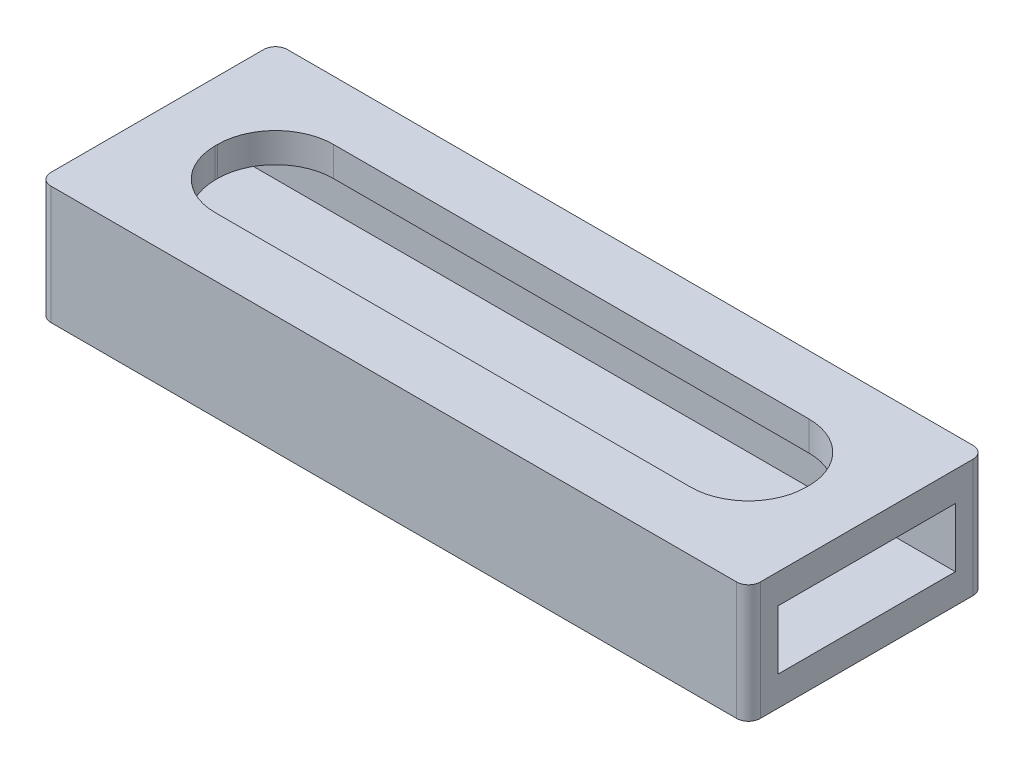
ISO-10303-21;
HEADER;
FILE_DESCRIPTION(('STEP AP214'),'2;1');
FILE_NAME('part.step','',(''),(''),'','','');
FILE_SCHEMA(('AUTOMOTIVE_DESIGN { 1 0 10303 214 1 1 1 1 }'));
ENDSEC;
DATA;
#1=APPLICATION_CONTEXT('core data for automotive mechanical design processes');
#2=APPLICATION_PROTOCOL_DEFINITION('international standard','automotive_design',2000,#1);
#3=PRODUCT_CONTEXT('',#1,'mechanical');
#4=PRODUCT('Part','Part','',(#3));
#5=PRODUCT_RELATED_PRODUCT_CATEGORY('part','',(#4));
#6=PRODUCT_DEFINITION_FORMATION('','',#4);
#7=PRODUCT_DEFINITION_CONTEXT('part definition',#1,'design');
#8=PRODUCT_DEFINITION('design','',#6,#7);
#9=PRODUCT_DEFINITION_SHAPE('','',#8);
#10=(LENGTH_UNIT() NAMED_UNIT(*) SI_UNIT(.MILLI.,.METRE.));
#11=(NAMED_UNIT(*) PLANE_ANGLE_UNIT() SI_UNIT($,.RADIAN.));
#12=(NAMED_UNIT(*) SI_UNIT($,.STERADIAN.) SOLID_ANGLE_UNIT());
#13=UNCERTAINTY_MEASURE_WITH_UNIT(LENGTH_MEASURE(1.E-05),#10,'distance_accuracy_value','');
#14=(GEOMETRIC_REPRESENTATION_CONTEXT(3) GLOBAL_UNCERTAINTY_ASSIGNED_CONTEXT((#13)) GLOBAL_UNIT_ASSIGNED_CONTEXT((#10,
#11,#12)) REPRESENTATION_CONTEXT('',''));
#15=CARTESIAN_POINT('',(0.,0.,0.));
#16=DIRECTION('',(0.,0.,1.));
#17=DIRECTION('',(1.,0.,0.));
#18=AXIS2_PLACEMENT_3D('',#15,#16,#17);
#19=CARTESIAN_POINT('',(0.,12.7,0.));
#20=DIRECTION('',(1.,0.,0.));
#21=DIRECTION('',(0.,0.,-1.));
#22=AXIS2_PLACEMENT_3D('',#19,#20,#21);
#23=PLANE('',#22);
#24=DIRECTION('',(0.,0.,1.));
#25=VECTOR('',#24,1.);
#26=CARTESIAN_POINT('',(0.,9.525,-3.175));
#27=LINE('',#26,#25);
#28=CARTESIAN_POINT('',(0.,9.525,-22.225));
#29=VERTEX_POINT('',#28);
#30=CARTESIAN_POINT('',(0.,9.525,-3.175));
#31=VERTEX_POINT('',#30);
#32=EDGE_CURVE('E299',#29,#31,#27,.T.);
#33=ORIENTED_EDGE('',*,*,#32,.T.);
#34=DIRECTION('',(0.,-1.,0.));
#35=VECTOR('',#34,1.);
#36=CARTESIAN_POINT('',(0.,3.175,-3.175));
#37=LINE('',#36,#35);
#38=CARTESIAN_POINT('',(0.,3.175,-3.175));
#39=VERTEX_POINT('',#38);
#40=EDGE_CURVE('E285',#31,#39,#37,.T.);
#41=ORIENTED_EDGE('',*,*,#40,.T.);
#42=DIRECTION('',(0.,0.,-1.));
#43=VECTOR('',#42,1.);
#44=CARTESIAN_POINT('',(0.,3.175,-3.175));
#45=LINE('',#44,#43);
#46=CARTESIAN_POINT('',(0.,3.175,-22.225));
#47=VERTEX_POINT('',#46);
#48=EDGE_CURVE('E288',#39,#47,#45,.T.);
#49=ORIENTED_EDGE('',*,*,#48,.T.);
#50=DIRECTION('',(0.,1.,0.));
#51=VECTOR('',#50,1.);
#52=CARTESIAN_POINT('',(0.,3.175,-22.225));
#53=LINE('',#52,#51);
#54=EDGE_CURVE('E291',#47,#29,#53,.T.);
#55=ORIENTED_EDGE('',*,*,#54,.T.);
#56=EDGE_LOOP('',(#33,#41,#49,#55));
#57=FACE_BOUND('',#56,.T.);
#58=DIRECTION('',(0.,0.,1.));
#59=VECTOR('',#58,1.);
#60=CARTESIAN_POINT('',(0.,0.,0.));
#61=LINE('',#60,#59);
#62=CARTESIAN_POINT('',(0.,0.,-24.13));
#63=VERTEX_POINT('',#62);
#64=CARTESIAN_POINT('',(0.,0.,-1.27));
#65=VERTEX_POINT('',#64);
#66=EDGE_CURVE('E318',#63,#65,#61,.T.);
#67=ORIENTED_EDGE('',*,*,#66,.T.);
#68=DIRECTION('',(0.,-1.,0.));
#69=VECTOR('',#68,1.);
#70=CARTESIAN_POINT('',(0.,12.7,-1.27));
#71=LINE('',#70,#69);
#72=CARTESIAN_POINT('',(0.,12.7,-1.27));
#73=VERTEX_POINT('',#72);
#74=EDGE_CURVE('E377',#65,#73,#71,.F.);
#75=ORIENTED_EDGE('',*,*,#74,.T.);
#76=DIRECTION('',(0.,0.,1.));
#77=VECTOR('',#76,1.);
#78=CARTESIAN_POINT('',(0.,12.7,0.));
#79=LINE('',#78,#77);
#80=CARTESIAN_POINT('',(0.,12.7,-24.13));
#81=VERTEX_POINT('',#80);
#82=EDGE_CURVE('E327',#81,#73,#79,.T.);
#83=ORIENTED_EDGE('',*,*,#82,.F.);
#84=DIRECTION('',(0.,-1.,0.));
#85=VECTOR('',#84,1.);
#86=CARTESIAN_POINT('',(0.,12.7,-24.13));
#87=LINE('',#86,#85);
#88=EDGE_CURVE('E374',#81,#63,#87,.T.);
#89=ORIENTED_EDGE('',*,*,#88,.T.);
#90=EDGE_LOOP('',(#67,#75,#83,#89));
#91=FACE_BOUND('',#90,.T.);
#92=ADVANCED_FACE('F44',(#57,#91),#23,.F.);
#93=CARTESIAN_POINT('',(0.,12.7,0.));
#94=DIRECTION('',(0.,0.,-1.));
#95=DIRECTION('',(-1.,0.,0.));
#96=AXIS2_PLACEMENT_3D('',#93,#94,#95);
#97=PLANE('',#96);
#98=DIRECTION('',(1.,0.,0.));
#99=VECTOR('',#98,1.);
#100=CARTESIAN_POINT('',(0.,12.7,0.));
#101=LINE('',#100,#99);
#102=CARTESIAN_POINT('',(1.27,12.7,0.));
#103=VERTEX_POINT('',#102);
#104=CARTESIAN_POINT('',(74.93,12.7,0.));
#105=VERTEX_POINT('',#104);
#106=EDGE_CURVE('E335',#103,#105,#101,.T.);
#107=ORIENTED_EDGE('',*,*,#106,.F.);
#108=DIRECTION('',(0.,-1.,0.));
#109=VECTOR('',#108,1.);
#110=CARTESIAN_POINT('',(1.27,12.7,0.));
#111=LINE('',#110,#109);
#112=CARTESIAN_POINT('',(1.27,0.,0.));
#113=VERTEX_POINT('',#112);
#114=EDGE_CURVE('E357',#103,#113,#111,.T.);
#115=ORIENTED_EDGE('',*,*,#114,.T.);
#116=DIRECTION('',(1.,0.,0.));
#117=VECTOR('',#116,1.);
#118=CARTESIAN_POINT('',(0.,0.,0.));
#119=LINE('',#118,#117);
#120=CARTESIAN_POINT('',(74.93,0.,0.));
#121=VERTEX_POINT('',#120);
#122=EDGE_CURVE('E350',#113,#121,#119,.T.);
#123=ORIENTED_EDGE('',*,*,#122,.T.);
#124=DIRECTION('',(0.,-1.,0.));
#125=VECTOR('',#124,1.);
#126=CARTESIAN_POINT('',(74.93,12.7,0.));
#127=LINE('',#126,#125);
#128=EDGE_CURVE('E343',#121,#105,#127,.F.);
#129=ORIENTED_EDGE('',*,*,#128,.T.);
#130=EDGE_LOOP('',(#107,#115,#123,#129));
#131=FACE_BOUND('',#130,.T.);
#132=ADVANCED_FACE('F429',(#131),#97,.F.);
#133=CARTESIAN_POINT('',(76.2,12.7,0.));
#134=DIRECTION('',(-1.,0.,0.));
#135=DIRECTION('',(0.,0.,1.));
#136=AXIS2_PLACEMENT_3D('',#133,#134,#135);
#137=PLANE('',#136);
#138=DIRECTION('',(0.,0.,-1.));
#139=VECTOR('',#138,1.);
#140=CARTESIAN_POINT('',(76.2,3.175,-3.175));
#141=LINE('',#140,#139);
#142=CARTESIAN_POINT('',(76.2,3.175,-3.175));
#143=VERTEX_POINT('',#142);
#144=CARTESIAN_POINT('',(76.2,3.175,-22.225));
#145=VERTEX_POINT('',#144);
#146=EDGE_CURVE('E302',#143,#145,#141,.T.);
#147=ORIENTED_EDGE('',*,*,#146,.F.);
#148=DIRECTION('',(0.,-1.,0.));
#149=VECTOR('',#148,1.);
#150=CARTESIAN_POINT('',(76.2,3.175,-3.175));
#151=LINE('',#150,#149);
#152=CARTESIAN_POINT('',(76.2,9.525,-3.175));
#153=VERTEX_POINT('',#152);
#154=EDGE_CURVE('E266',#153,#143,#151,.T.);
#155=ORIENTED_EDGE('',*,*,#154,.F.);
#156=DIRECTION('',(0.,0.,1.));
#157=VECTOR('',#156,1.);
#158=CARTESIAN_POINT('',(76.2,9.525,-3.175));
#159=LINE('',#158,#157);
#160=CARTESIAN_POINT('',(76.2,9.525,-22.225));
#161=VERTEX_POINT('',#160);
#162=EDGE_CURVE('E287',#161,#153,#159,.T.);
#163=ORIENTED_EDGE('',*,*,#162,.F.);
#164=DIRECTION('',(0.,1.,0.));
#165=VECTOR('',#164,1.);
#166=CARTESIAN_POINT('',(76.2,3.175,-22.225));
#167=LINE('',#166,#165);
#168=EDGE_CURVE('E306',#145,#161,#167,.T.);
#169=ORIENTED_EDGE('',*,*,#168,.F.);
#170=EDGE_LOOP('',(#147,#155,#163,#169));
#171=FACE_BOUND('',#170,.T.);
#172=DIRECTION('',(0.,0.,-1.));
#173=VECTOR('',#172,1.);
#174=CARTESIAN_POINT('',(76.2,12.7,0.));
#175=LINE('',#174,#173);
#176=CARTESIAN_POINT('',(76.2,12.7,-1.27));
#177=VERTEX_POINT('',#176);
#178=CARTESIAN_POINT('',(76.2,12.7,-24.13));
#179=VERTEX_POINT('',#178);
#180=EDGE_CURVE('E339',#177,#179,#175,.T.);
#181=ORIENTED_EDGE('',*,*,#180,.F.);
#182=DIRECTION('',(0.,-1.,0.));
#183=VECTOR('',#182,1.);
#184=CARTESIAN_POINT('',(76.2,12.7,-1.27));
#185=LINE('',#184,#183);
#186=CARTESIAN_POINT('',(76.2,0.,-1.27));
#187=VERTEX_POINT('',#186);
#188=EDGE_CURVE('E396',#177,#187,#185,.T.);
#189=ORIENTED_EDGE('',*,*,#188,.T.);
#190=DIRECTION('',(0.,0.,-1.));
#191=VECTOR('',#190,1.);
#192=CARTESIAN_POINT('',(76.2,0.,0.));
#193=LINE('',#192,#191);
#194=CARTESIAN_POINT('',(76.2,0.,-24.13));
#195=VERTEX_POINT('',#194);
#196=EDGE_CURVE('E353',#187,#195,#193,.T.);
#197=ORIENTED_EDGE('',*,*,#196,.T.);
#198=DIRECTION('',(0.,-1.,0.));
#199=VECTOR('',#198,1.);
#200=CARTESIAN_POINT('',(76.2,12.7,-24.13));
#201=LINE('',#200,#199);
#202=EDGE_CURVE('E392',#195,#179,#201,.F.);
#203=ORIENTED_EDGE('',*,*,#202,.T.);
#204=EDGE_LOOP('',(#181,#189,#197,#203));
#205=FACE_BOUND('',#204,.T.);
#206=ADVANCED_FACE('F404',(#171,#205),#137,.F.);
#207=CARTESIAN_POINT('',(0.,12.7,-25.4));
#208=DIRECTION('',(0.,0.,1.));
#209=DIRECTION('',(1.,0.,0.));
#210=AXIS2_PLACEMENT_3D('',#207,#208,#209);
#211=PLANE('',#210);
#212=DIRECTION('',(-1.,0.,0.));
#213=VECTOR('',#212,1.);
#214=CARTESIAN_POINT('',(0.,12.7,-25.4));
#215=LINE('',#214,#213);
#216=CARTESIAN_POINT('',(74.93,12.7,-25.4));
#217=VERTEX_POINT('',#216);
#218=CARTESIAN_POINT('',(1.27,12.7,-25.4));
#219=VERTEX_POINT('',#218);
#220=EDGE_CURVE('E336',#217,#219,#215,.T.);
#221=ORIENTED_EDGE('',*,*,#220,.F.);
#222=DIRECTION('',(0.,-1.,0.));
#223=VECTOR('',#222,1.);
#224=CARTESIAN_POINT('',(74.93,12.7,-25.4));
#225=LINE('',#224,#223);
#226=CARTESIAN_POINT('',(74.93,0.,-25.4));
#227=VERTEX_POINT('',#226);
#228=EDGE_CURVE('E11',#217,#227,#225,.T.);
#229=ORIENTED_EDGE('',*,*,#228,.T.);
#230=DIRECTION('',(-1.,0.,0.));
#231=VECTOR('',#230,1.);
#232=CARTESIAN_POINT('',(0.,0.,-25.4));
#233=LINE('',#232,#231);
#234=CARTESIAN_POINT('',(1.27,0.,-25.4));
#235=VERTEX_POINT('',#234);
#236=EDGE_CURVE('E334',#227,#235,#233,.T.);
#237=ORIENTED_EDGE('',*,*,#236,.T.);
#238=DIRECTION('',(0.,-1.,0.));
#239=VECTOR('',#238,1.);
#240=CARTESIAN_POINT('',(1.27,12.7,-25.4));
#241=LINE('',#240,#239);
#242=EDGE_CURVE('E53',#235,#219,#241,.F.);
#243=ORIENTED_EDGE('',*,*,#242,.T.);
#244=EDGE_LOOP('',(#221,#229,#237,#243));
#245=FACE_BOUND('',#244,.T.);
#246=ADVANCED_FACE('F414',(#245),#211,.F.);
#247=CARTESIAN_POINT('',(0.,12.7,0.));
#248=DIRECTION('',(0.,-1.,0.));
#249=DIRECTION('',(0.,0.,-1.));
#250=AXIS2_PLACEMENT_3D('',#247,#248,#249);
#251=PLANE('',#250);
#252=DIRECTION('',(-1.,0.,0.));
#253=VECTOR('',#252,1.);
#254=CARTESIAN_POINT('',(12.573,12.7,-19.05));
#255=LINE('',#254,#253);
#256=CARTESIAN_POINT('',(63.6269999999999,12.7,-19.05));
#257=VERTEX_POINT('',#256);
#258=CARTESIAN_POINT('',(12.573,12.7,-19.05));
#259=VERTEX_POINT('',#258);
#260=EDGE_CURVE('E243',#257,#259,#255,.T.);
#261=ORIENTED_EDGE('',*,*,#260,.F.);
#262=CARTESIAN_POINT('',(63.627,12.7,-12.827));
#263=DIRECTION('',(0.,1.,0.));
#264=DIRECTION('',(0.,0.,-1.));
#265=AXIS2_PLACEMENT_3D('',#262,#263,#264);
#266=CIRCLE('',#265,6.223);
#267=CARTESIAN_POINT('',(69.85,12.7,-12.827));
#268=VERTEX_POINT('',#267);
#269=EDGE_CURVE('E191',#268,#257,#266,.T.);
#270=ORIENTED_EDGE('',*,*,#269,.F.);
#271=DIRECTION('',(0.,0.,-1.));
#272=VECTOR('',#271,1.);
#273=CARTESIAN_POINT('',(69.85,12.7,-12.573));
#274=LINE('',#273,#272);
#275=CARTESIAN_POINT('',(69.85,12.7,-12.573));
#276=VERTEX_POINT('',#275);
#277=EDGE_CURVE('E213',#276,#268,#274,.T.);
#278=ORIENTED_EDGE('',*,*,#277,.F.);
#279=CARTESIAN_POINT('',(63.627,12.7,-12.573));
#280=DIRECTION('',(0.,1.,0.));
#281=DIRECTION('',(0.,0.,-1.));
#282=AXIS2_PLACEMENT_3D('',#279,#280,#281);
#283=CIRCLE('',#282,6.223);
#284=CARTESIAN_POINT('',(63.6269999999999,12.7,-6.35));
#285=VERTEX_POINT('',#284);
#286=EDGE_CURVE('E220',#285,#276,#283,.T.);
#287=ORIENTED_EDGE('',*,*,#286,.F.);
#288=DIRECTION('',(1.,0.,0.));
#289=VECTOR('',#288,1.);
#290=CARTESIAN_POINT('',(12.573,12.7,-6.35));
#291=LINE('',#290,#289);
#292=CARTESIAN_POINT('',(12.573,12.7,-6.35));
#293=VERTEX_POINT('',#292);
#294=EDGE_CURVE('E258',#293,#285,#291,.T.);
#295=ORIENTED_EDGE('',*,*,#294,.F.);
#296=CARTESIAN_POINT('',(12.573,12.7,-12.573));
#297=DIRECTION('',(0.,1.,0.));
#298=DIRECTION('',(0.,0.,-1.));
#299=AXIS2_PLACEMENT_3D('',#296,#297,#298);
#300=CIRCLE('',#299,6.223);
#301=CARTESIAN_POINT('',(6.35,12.7,-12.573));
#302=VERTEX_POINT('',#301);
#303=EDGE_CURVE('E252',#302,#293,#300,.T.);
#304=ORIENTED_EDGE('',*,*,#303,.F.);
#305=DIRECTION('',(0.,0.,1.));
#306=VECTOR('',#305,1.);
#307=CARTESIAN_POINT('',(6.35,12.7,-12.573));
#308=LINE('',#307,#306);
#309=CARTESIAN_POINT('',(6.35,12.7,-12.827));
#310=VERTEX_POINT('',#309);
#311=EDGE_CURVE('E248',#310,#302,#308,.T.);
#312=ORIENTED_EDGE('',*,*,#311,.F.);
#313=CARTESIAN_POINT('',(12.573,12.7,-12.827));
#314=DIRECTION('',(0.,1.,0.));
#315=DIRECTION('',(0.,0.,-1.));
#316=AXIS2_PLACEMENT_3D('',#313,#314,#315);
#317=CIRCLE('',#316,6.223);
#318=EDGE_CURVE('E245',#259,#310,#317,.T.);
#319=ORIENTED_EDGE('',*,*,#318,.F.);
#320=EDGE_LOOP('',(#261,#270,#278,#287,#295,#304,#312,#319));
#321=FACE_BOUND('',#320,.T.);
#322=ORIENTED_EDGE('',*,*,#82,.T.);
#323=CARTESIAN_POINT('',(1.27,12.7,-1.27));
#324=DIRECTION('',(0.,-1.,0.));
#325=DIRECTION('',(0.,0.,-1.));
#326=AXIS2_PLACEMENT_3D('',#323,#324,#325);
#327=CIRCLE('',#326,1.27);
#328=EDGE_CURVE('E388',#73,#103,#327,.F.);
#329=ORIENTED_EDGE('',*,*,#328,.T.);
#330=ORIENTED_EDGE('',*,*,#106,.T.);
#331=CARTESIAN_POINT('',(74.93,12.7,-1.27));
#332=DIRECTION('',(0.,-1.,0.));
#333=DIRECTION('',(0.,0.,-1.));
#334=AXIS2_PLACEMENT_3D('',#331,#332,#333);
#335=CIRCLE('',#334,1.27);
#336=EDGE_CURVE('E390',#105,#177,#335,.F.);
#337=ORIENTED_EDGE('',*,*,#336,.T.);
#338=ORIENTED_EDGE('',*,*,#180,.T.);
#339=CARTESIAN_POINT('',(74.93,12.7,-24.13));
#340=DIRECTION('',(0.,-1.,0.));
#341=DIRECTION('',(0.,0.,-1.));
#342=AXIS2_PLACEMENT_3D('',#339,#340,#341);
#343=CIRCLE('',#342,1.27);
#344=EDGE_CURVE('E70',#179,#217,#343,.F.);
#345=ORIENTED_EDGE('',*,*,#344,.T.);
#346=ORIENTED_EDGE('',*,*,#220,.T.);
#347=CARTESIAN_POINT('',(1.27,12.7,-24.13));
#348=DIRECTION('',(0.,-1.,0.));
#349=DIRECTION('',(0.,0.,-1.));
#350=AXIS2_PLACEMENT_3D('',#347,#348,#349);
#351=CIRCLE('',#350,1.27);
#352=EDGE_CURVE('E385',#219,#81,#351,.F.);
#353=ORIENTED_EDGE('',*,*,#352,.T.);
#354=EDGE_LOOP('',(#322,#329,#330,#337,#338,#345,#346,#353));
#355=FACE_BOUND('',#354,.T.);
#356=ADVANCED_FACE('F417',(#321,#355),#251,.F.);
#357=CARTESIAN_POINT('',(0.,0.,0.));
#358=DIRECTION('',(0.,-1.,0.));
#359=DIRECTION('',(0.,0.,-1.));
#360=AXIS2_PLACEMENT_3D('',#357,#358,#359);
#361=PLANE('',#360);
#362=ORIENTED_EDGE('',*,*,#122,.F.);
#363=CARTESIAN_POINT('',(1.27,0.,-1.27));
#364=DIRECTION('',(0.,-1.,0.));
#365=DIRECTION('',(0.,0.,-1.));
#366=AXIS2_PLACEMENT_3D('',#363,#364,#365);
#367=CIRCLE('',#366,1.27);
#368=EDGE_CURVE('E375',#113,#65,#367,.T.);
#369=ORIENTED_EDGE('',*,*,#368,.T.);
#370=ORIENTED_EDGE('',*,*,#66,.F.);
#371=CARTESIAN_POINT('',(1.27,0.,-24.13));
#372=DIRECTION('',(0.,-1.,0.));
#373=DIRECTION('',(0.,0.,-1.));
#374=AXIS2_PLACEMENT_3D('',#371,#372,#373);
#375=CIRCLE('',#374,1.27);
#376=EDGE_CURVE('E361',#63,#235,#375,.T.);
#377=ORIENTED_EDGE('',*,*,#376,.T.);
#378=ORIENTED_EDGE('',*,*,#236,.F.);
#379=CARTESIAN_POINT('',(74.93,0.,-24.13));
#380=DIRECTION('',(0.,-1.,0.));
#381=DIRECTION('',(0.,0.,-1.));
#382=AXIS2_PLACEMENT_3D('',#379,#380,#381);
#383=CIRCLE('',#382,1.27);
#384=EDGE_CURVE('E368',#227,#195,#383,.T.);
#385=ORIENTED_EDGE('',*,*,#384,.T.);
#386=ORIENTED_EDGE('',*,*,#196,.F.);
#387=CARTESIAN_POINT('',(74.93,0.,-1.27));
#388=DIRECTION('',(0.,-1.,0.));
#389=DIRECTION('',(0.,0.,-1.));
#390=AXIS2_PLACEMENT_3D('',#387,#388,#389);
#391=CIRCLE('',#390,1.27);
#392=EDGE_CURVE('E369',#187,#121,#391,.T.);
#393=ORIENTED_EDGE('',*,*,#392,.T.);
#394=EDGE_LOOP('',(#362,#369,#370,#377,#378,#385,#386,#393));
#395=FACE_BOUND('',#394,.T.);
#396=ADVANCED_FACE('F406',(#395),#361,.T.);
#397=CARTESIAN_POINT('',(0.,3.175,-3.175));
#398=DIRECTION('',(0.,0.,1.));
#399=DIRECTION('',(1.,0.,0.));
#400=AXIS2_PLACEMENT_3D('',#397,#398,#399);
#401=PLANE('',#400);
#402=ORIENTED_EDGE('',*,*,#154,.T.);
#403=DIRECTION('',(1.,0.,0.));
#404=VECTOR('',#403,1.);
#405=CARTESIAN_POINT('',(0.,3.175,-3.175));
#406=LINE('',#405,#404);
#407=EDGE_CURVE('E301',#39,#143,#406,.T.);
#408=ORIENTED_EDGE('',*,*,#407,.F.);
#409=ORIENTED_EDGE('',*,*,#40,.F.);
#410=DIRECTION('',(1.,0.,0.));
#411=VECTOR('',#410,1.);
#412=CARTESIAN_POINT('',(0.,9.525,-3.175));
#413=LINE('',#412,#411);
#414=EDGE_CURVE('E312',#31,#153,#413,.T.);
#415=ORIENTED_EDGE('',*,*,#414,.T.);
#416=EDGE_LOOP('',(#402,#408,#409,#415));
#417=FACE_BOUND('',#416,.T.);
#418=ADVANCED_FACE('F457',(#417),#401,.F.);
#419=CARTESIAN_POINT('',(0.,9.525,-3.175));
#420=DIRECTION('',(0.,1.,0.));
#421=DIRECTION('',(0.,0.,1.));
#422=AXIS2_PLACEMENT_3D('',#419,#420,#421);
#423=PLANE('',#422);
#424=DIRECTION('',(0.,0.,-1.));
#425=VECTOR('',#424,1.);
#426=CARTESIAN_POINT('',(69.85,9.525,-12.573));
#427=LINE('',#426,#425);
#428=CARTESIAN_POINT('',(69.85,9.525,-12.573));
#429=VERTEX_POINT('',#428);
#430=CARTESIAN_POINT('',(69.85,9.525,-12.827));
#431=VERTEX_POINT('',#430);
#432=EDGE_CURVE('E197',#429,#431,#427,.T.);
#433=ORIENTED_EDGE('',*,*,#432,.T.);
#434=CARTESIAN_POINT('',(63.627,9.525,-12.827));
#435=DIRECTION('',(0.,1.,0.));
#436=DIRECTION('',(0.,0.,-1.));
#437=AXIS2_PLACEMENT_3D('',#434,#435,#436);
#438=CIRCLE('',#437,6.223);
#439=CARTESIAN_POINT('',(63.6269999999999,9.525,-19.05));
#440=VERTEX_POINT('',#439);
#441=EDGE_CURVE('E187',#431,#440,#438,.T.);
#442=ORIENTED_EDGE('',*,*,#441,.T.);
#443=DIRECTION('',(-1.,0.,0.));
#444=VECTOR('',#443,1.);
#445=CARTESIAN_POINT('',(12.573,9.525,-19.05));
#446=LINE('',#445,#444);
#447=CARTESIAN_POINT('',(12.573,9.525,-19.05));
#448=VERTEX_POINT('',#447);
#449=EDGE_CURVE('E203',#440,#448,#446,.T.);
#450=ORIENTED_EDGE('',*,*,#449,.T.);
#451=CARTESIAN_POINT('',(12.573,9.525,-12.827));
#452=DIRECTION('',(0.,1.,0.));
#453=DIRECTION('',(0.,0.,-1.));
#454=AXIS2_PLACEMENT_3D('',#451,#452,#453);
#455=CIRCLE('',#454,6.223);
#456=CARTESIAN_POINT('',(6.35,9.525,-12.827));
#457=VERTEX_POINT('',#456);
#458=EDGE_CURVE('E206',#448,#457,#455,.T.);
#459=ORIENTED_EDGE('',*,*,#458,.T.);
#460=DIRECTION('',(0.,0.,1.));
#461=VECTOR('',#460,1.);
#462=CARTESIAN_POINT('',(6.35,9.525,-12.573));
#463=LINE('',#462,#461);
#464=CARTESIAN_POINT('',(6.35,9.525,-12.573));
#465=VERTEX_POINT('',#464);
#466=EDGE_CURVE('E225',#457,#465,#463,.T.);
#467=ORIENTED_EDGE('',*,*,#466,.T.);
#468=CARTESIAN_POINT('',(12.573,9.525,-12.573));
#469=DIRECTION('',(0.,1.,0.));
#470=DIRECTION('',(0.,0.,-1.));
#471=AXIS2_PLACEMENT_3D('',#468,#469,#470);
#472=CIRCLE('',#471,6.223);
#473=CARTESIAN_POINT('',(12.573,9.525,-6.35));
#474=VERTEX_POINT('',#473);
#475=EDGE_CURVE('E228',#465,#474,#472,.T.);
#476=ORIENTED_EDGE('',*,*,#475,.T.);
#477=DIRECTION('',(1.,0.,0.));
#478=VECTOR('',#477,1.);
#479=CARTESIAN_POINT('',(12.573,9.525,-6.35));
#480=LINE('',#479,#478);
#481=CARTESIAN_POINT('',(63.6269999999999,9.525,-6.35));
#482=VERTEX_POINT('',#481);
#483=EDGE_CURVE('E226',#474,#482,#480,.T.);
#484=ORIENTED_EDGE('',*,*,#483,.T.);
#485=CARTESIAN_POINT('',(63.627,9.525,-12.573));
#486=DIRECTION('',(0.,1.,0.));
#487=DIRECTION('',(0.,0.,-1.));
#488=AXIS2_PLACEMENT_3D('',#485,#486,#487);
#489=CIRCLE('',#488,6.223);
#490=EDGE_CURVE('E232',#482,#429,#489,.T.);
#491=ORIENTED_EDGE('',*,*,#490,.T.);
#492=EDGE_LOOP('',(#433,#442,#450,#459,#467,#476,#484,#491));
#493=FACE_BOUND('',#492,.T.);
#494=ORIENTED_EDGE('',*,*,#162,.T.);
#495=ORIENTED_EDGE('',*,*,#414,.F.);
#496=ORIENTED_EDGE('',*,*,#32,.F.);
#497=DIRECTION('',(1.,0.,0.));
#498=VECTOR('',#497,1.);
#499=CARTESIAN_POINT('',(0.,9.525,-22.225));
#500=LINE('',#499,#498);
#501=EDGE_CURVE('E317',#29,#161,#500,.T.);
#502=ORIENTED_EDGE('',*,*,#501,.T.);
#503=EDGE_LOOP('',(#494,#495,#496,#502));
#504=FACE_BOUND('',#503,.T.);
#505=ADVANCED_FACE('F208',(#493,#504),#423,.F.);
#506=CARTESIAN_POINT('',(0.,3.175,-22.225));
#507=DIRECTION('',(0.,0.,-1.));
#508=DIRECTION('',(-1.,0.,0.));
#509=AXIS2_PLACEMENT_3D('',#506,#507,#508);
#510=PLANE('',#509);
#511=ORIENTED_EDGE('',*,*,#168,.T.);
#512=ORIENTED_EDGE('',*,*,#501,.F.);
#513=ORIENTED_EDGE('',*,*,#54,.F.);
#514=DIRECTION('',(1.,0.,0.));
#515=VECTOR('',#514,1.);
#516=CARTESIAN_POINT('',(0.,3.175,-22.225));
#517=LINE('',#516,#515);
#518=EDGE_CURVE('E325',#47,#145,#517,.T.);
#519=ORIENTED_EDGE('',*,*,#518,.T.);
#520=EDGE_LOOP('',(#511,#512,#513,#519));
#521=FACE_BOUND('',#520,.T.);
#522=ADVANCED_FACE('F466',(#521),#510,.F.);
#523=CARTESIAN_POINT('',(0.,3.175,-3.175));
#524=DIRECTION('',(0.,-1.,0.));
#525=DIRECTION('',(0.,0.,-1.));
#526=AXIS2_PLACEMENT_3D('',#523,#524,#525);
#527=PLANE('',#526);
#528=ORIENTED_EDGE('',*,*,#146,.T.);
#529=ORIENTED_EDGE('',*,*,#518,.F.);
#530=ORIENTED_EDGE('',*,*,#48,.F.);
#531=ORIENTED_EDGE('',*,*,#407,.T.);
#532=EDGE_LOOP('',(#528,#529,#530,#531));
#533=FACE_BOUND('',#532,.T.);
#534=ADVANCED_FACE('F462',(#533),#527,.F.);
#535=CARTESIAN_POINT('',(63.627,9.525,-12.827));
#536=DIRECTION('',(0.,1.,0.));
#537=DIRECTION('',(0.,0.,1.));
#538=AXIS2_PLACEMENT_3D('',#535,#536,#537);
#539=CYLINDRICAL_SURFACE('',#538,6.223);
#540=ORIENTED_EDGE('',*,*,#269,.T.);
#541=DIRECTION('',(0.,1.,0.));
#542=VECTOR('',#541,1.);
#543=CARTESIAN_POINT('',(63.6269999999999,9.525,-19.05));
#544=LINE('',#543,#542);
#545=EDGE_CURVE('E184',#440,#257,#544,.T.);
#546=ORIENTED_EDGE('',*,*,#545,.F.);
#547=ORIENTED_EDGE('',*,*,#441,.F.);
#548=DIRECTION('',(0.,1.,0.));
#549=VECTOR('',#548,1.);
#550=CARTESIAN_POINT('',(69.85,9.525,-12.827));
#551=LINE('',#550,#549);
#552=EDGE_CURVE('E263',#431,#268,#551,.T.);
#553=ORIENTED_EDGE('',*,*,#552,.T.);
#554=EDGE_LOOP('',(#540,#546,#547,#553));
#555=FACE_BOUND('',#554,.T.);
#556=ADVANCED_FACE('F188',(#555),#539,.F.);
#557=CARTESIAN_POINT('',(69.85,9.525,-12.573));
#558=DIRECTION('',(1.,0.,0.));
#559=DIRECTION('',(0.,0.,-1.));
#560=AXIS2_PLACEMENT_3D('',#557,#558,#559);
#561=PLANE('',#560);
#562=ORIENTED_EDGE('',*,*,#277,.T.);
#563=ORIENTED_EDGE('',*,*,#552,.F.);
#564=ORIENTED_EDGE('',*,*,#432,.F.);
#565=DIRECTION('',(0.,1.,0.));
#566=VECTOR('',#565,1.);
#567=CARTESIAN_POINT('',(69.85,9.525,-12.573));
#568=LINE('',#567,#566);
#569=EDGE_CURVE('E270',#429,#276,#568,.T.);
#570=ORIENTED_EDGE('',*,*,#569,.T.);
#571=EDGE_LOOP('',(#562,#563,#564,#570));
#572=FACE_BOUND('',#571,.T.);
#573=ADVANCED_FACE('F474',(#572),#561,.F.);
#574=CARTESIAN_POINT('',(63.627,9.525,-12.573));
#575=DIRECTION('',(0.,1.,0.));
#576=DIRECTION('',(0.,0.,1.));
#577=AXIS2_PLACEMENT_3D('',#574,#575,#576);
#578=CYLINDRICAL_SURFACE('',#577,6.223);
#579=ORIENTED_EDGE('',*,*,#286,.T.);
#580=ORIENTED_EDGE('',*,*,#569,.F.);
#581=ORIENTED_EDGE('',*,*,#490,.F.);
#582=DIRECTION('',(0.,1.,0.));
#583=VECTOR('',#582,1.);
#584=CARTESIAN_POINT('',(63.6269999999999,9.525,-6.35));
#585=LINE('',#584,#583);
#586=EDGE_CURVE('E269',#482,#285,#585,.T.);
#587=ORIENTED_EDGE('',*,*,#586,.T.);
#588=EDGE_LOOP('',(#579,#580,#581,#587));
#589=FACE_BOUND('',#588,.T.);
#590=ADVANCED_FACE('F495',(#589),#578,.F.);
#591=CARTESIAN_POINT('',(12.573,9.525,-6.35));
#592=DIRECTION('',(0.,0.,1.));
#593=DIRECTION('',(1.,0.,0.));
#594=AXIS2_PLACEMENT_3D('',#591,#592,#593);
#595=PLANE('',#594);
#596=ORIENTED_EDGE('',*,*,#294,.T.);
#597=ORIENTED_EDGE('',*,*,#586,.F.);
#598=ORIENTED_EDGE('',*,*,#483,.F.);
#599=DIRECTION('',(0.,1.,0.));
#600=VECTOR('',#599,1.);
#601=CARTESIAN_POINT('',(12.573,9.525,-6.35));
#602=LINE('',#601,#600);
#603=EDGE_CURVE('E272',#474,#293,#602,.T.);
#604=ORIENTED_EDGE('',*,*,#603,.T.);
#605=EDGE_LOOP('',(#596,#597,#598,#604));
#606=FACE_BOUND('',#605,.T.);
#607=ADVANCED_FACE('F488',(#606),#595,.F.);
#608=CARTESIAN_POINT('',(12.573,9.525,-12.573));
#609=DIRECTION('',(0.,1.,0.));
#610=DIRECTION('',(0.,0.,1.));
#611=AXIS2_PLACEMENT_3D('',#608,#609,#610);
#612=CYLINDRICAL_SURFACE('',#611,6.223);
#613=ORIENTED_EDGE('',*,*,#303,.T.);
#614=ORIENTED_EDGE('',*,*,#603,.F.);
#615=ORIENTED_EDGE('',*,*,#475,.F.);
#616=DIRECTION('',(0.,1.,0.));
#617=VECTOR('',#616,1.);
#618=CARTESIAN_POINT('',(6.35,9.525,-12.573));
#619=LINE('',#618,#617);
#620=EDGE_CURVE('E277',#465,#302,#619,.T.);
#621=ORIENTED_EDGE('',*,*,#620,.T.);
#622=EDGE_LOOP('',(#613,#614,#615,#621));
#623=FACE_BOUND('',#622,.T.);
#624=ADVANCED_FACE('F482',(#623),#612,.F.);
#625=CARTESIAN_POINT('',(6.35,9.525,-12.573));
#626=DIRECTION('',(-1.,0.,0.));
#627=DIRECTION('',(0.,0.,1.));
#628=AXIS2_PLACEMENT_3D('',#625,#626,#627);
#629=PLANE('',#628);
#630=ORIENTED_EDGE('',*,*,#311,.T.);
#631=ORIENTED_EDGE('',*,*,#620,.F.);
#632=ORIENTED_EDGE('',*,*,#466,.F.);
#633=DIRECTION('',(0.,1.,0.));
#634=VECTOR('',#633,1.);
#635=CARTESIAN_POINT('',(6.35,9.525,-12.827));
#636=LINE('',#635,#634);
#637=EDGE_CURVE('E276',#457,#310,#636,.T.);
#638=ORIENTED_EDGE('',*,*,#637,.T.);
#639=EDGE_LOOP('',(#630,#631,#632,#638));
#640=FACE_BOUND('',#639,.T.);
#641=ADVANCED_FACE('F477',(#640),#629,.F.);
#642=CARTESIAN_POINT('',(12.573,9.525,-12.827));
#643=DIRECTION('',(0.,1.,0.));
#644=DIRECTION('',(0.,0.,1.));
#645=AXIS2_PLACEMENT_3D('',#642,#643,#644);
#646=CYLINDRICAL_SURFACE('',#645,6.223);
#647=ORIENTED_EDGE('',*,*,#318,.T.);
#648=ORIENTED_EDGE('',*,*,#637,.F.);
#649=ORIENTED_EDGE('',*,*,#458,.F.);
#650=DIRECTION('',(0.,1.,0.));
#651=VECTOR('',#650,1.);
#652=CARTESIAN_POINT('',(12.573,9.525,-19.05));
#653=LINE('',#652,#651);
#654=EDGE_CURVE('E198',#448,#259,#653,.T.);
#655=ORIENTED_EDGE('',*,*,#654,.T.);
#656=EDGE_LOOP('',(#647,#648,#649,#655));
#657=FACE_BOUND('',#656,.T.);
#658=ADVANCED_FACE('F480',(#657),#646,.F.);
#659=CARTESIAN_POINT('',(12.573,9.525,-19.05));
#660=DIRECTION('',(0.,0.,-1.));
#661=DIRECTION('',(-1.,0.,0.));
#662=AXIS2_PLACEMENT_3D('',#659,#660,#661);
#663=PLANE('',#662);
#664=ORIENTED_EDGE('',*,*,#260,.T.);
#665=ORIENTED_EDGE('',*,*,#654,.F.);
#666=ORIENTED_EDGE('',*,*,#449,.F.);
#667=ORIENTED_EDGE('',*,*,#545,.T.);
#668=EDGE_LOOP('',(#664,#665,#666,#667));
#669=FACE_BOUND('',#668,.T.);
#670=ADVANCED_FACE('F205',(#669),#663,.F.);
#671=CARTESIAN_POINT('',(1.27,12.7,-1.27));
#672=DIRECTION('',(0.,-1.,0.));
#673=DIRECTION('',(0.,0.,-1.));
#674=AXIS2_PLACEMENT_3D('',#671,#672,#673);
#675=CYLINDRICAL_SURFACE('',#674,1.27);
#676=ORIENTED_EDGE('',*,*,#328,.F.);
#677=ORIENTED_EDGE('',*,*,#74,.F.);
#678=ORIENTED_EDGE('',*,*,#368,.F.);
#679=ORIENTED_EDGE('',*,*,#114,.F.);
#680=EDGE_LOOP('',(#676,#677,#678,#679));
#681=FACE_BOUND('',#680,.T.);
#682=ADVANCED_FACE('F430',(#681),#675,.T.);
#683=CARTESIAN_POINT('',(74.93,12.7,-1.27));
#684=DIRECTION('',(0.,-1.,0.));
#685=DIRECTION('',(0.,0.,-1.));
#686=AXIS2_PLACEMENT_3D('',#683,#684,#685);
#687=CYLINDRICAL_SURFACE('',#686,1.27);
#688=ORIENTED_EDGE('',*,*,#336,.F.);
#689=ORIENTED_EDGE('',*,*,#128,.F.);
#690=ORIENTED_EDGE('',*,*,#392,.F.);
#691=ORIENTED_EDGE('',*,*,#188,.F.);
#692=EDGE_LOOP('',(#688,#689,#690,#691));
#693=FACE_BOUND('',#692,.T.);
#694=ADVANCED_FACE('F435',(#693),#687,.T.);
#695=CARTESIAN_POINT('',(74.93,12.7,-24.13));
#696=DIRECTION('',(0.,-1.,0.));
#697=DIRECTION('',(0.,0.,-1.));
#698=AXIS2_PLACEMENT_3D('',#695,#696,#697);
#699=CYLINDRICAL_SURFACE('',#698,1.27);
#700=ORIENTED_EDGE('',*,*,#344,.F.);
#701=ORIENTED_EDGE('',*,*,#202,.F.);
#702=ORIENTED_EDGE('',*,*,#384,.F.);
#703=ORIENTED_EDGE('',*,*,#228,.F.);
#704=EDGE_LOOP('',(#700,#701,#702,#703));
#705=FACE_BOUND('',#704,.T.);
#706=ADVANCED_FACE('F412',(#705),#699,.T.);
#707=CARTESIAN_POINT('',(1.27,12.7,-24.13));
#708=DIRECTION('',(0.,-1.,0.));
#709=DIRECTION('',(0.,0.,-1.));
#710=AXIS2_PLACEMENT_3D('',#707,#708,#709);
#711=CYLINDRICAL_SURFACE('',#710,1.27);
#712=ORIENTED_EDGE('',*,*,#352,.F.);
#713=ORIENTED_EDGE('',*,*,#242,.F.);
#714=ORIENTED_EDGE('',*,*,#376,.F.);
#715=ORIENTED_EDGE('',*,*,#88,.F.);
#716=EDGE_LOOP('',(#712,#713,#714,#715));
#717=FACE_BOUND('',#716,.T.);
#718=ADVANCED_FACE('F50',(#717),#711,.T.);
#719=CLOSED_SHELL('',(#92,#132,#206,#246,#356,#396,#418,#505,#522,#534,#556,#573,#590,#607,#624,
#641,#658,#670,#682,#694,#706,#718));
#720=MANIFOLD_SOLID_BREP('B2',#719);
#721=ADVANCED_BREP_SHAPE_REPRESENTATION('',(#18,#720),#14);
#722=SHAPE_DEFINITION_REPRESENTATION(#9,#721);
ENDSEC;
END-ISO-10303-21;
